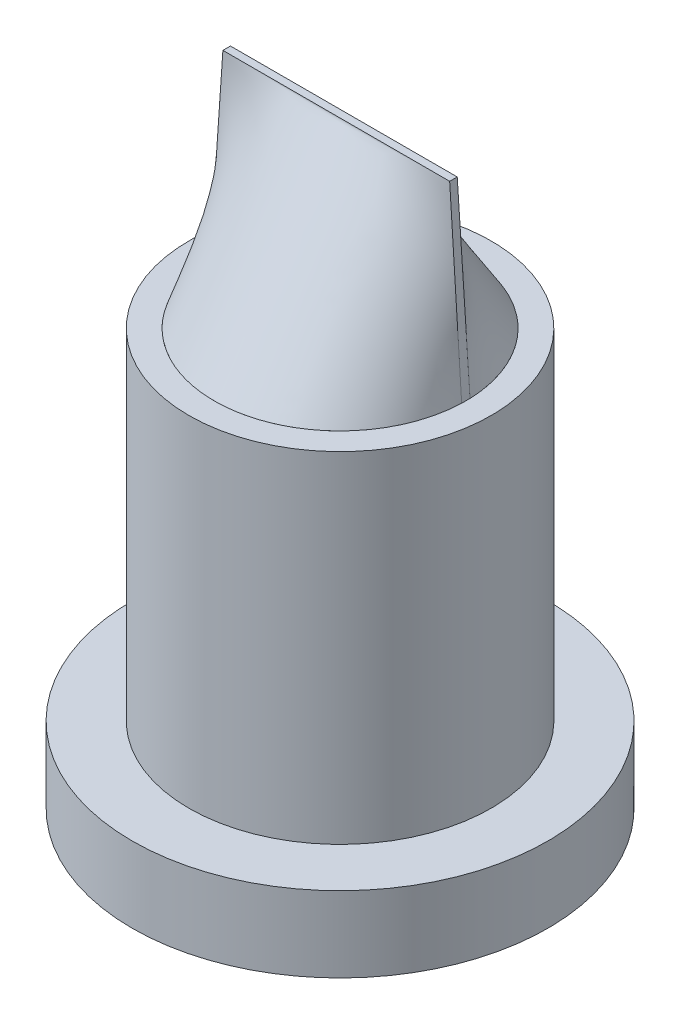
ISO-10303-21;
HEADER;
FILE_DESCRIPTION(('STEP AP214'),'2;1');
FILE_NAME('part.step','',(''),(''),'','','');
FILE_SCHEMA(('AUTOMOTIVE_DESIGN { 1 0 10303 214 1 1 1 1 }'));
ENDSEC;
DATA;
#1=APPLICATION_CONTEXT('core data for automotive mechanical design processes');
#2=APPLICATION_PROTOCOL_DEFINITION('international standard','automotive_design',2000,#1);
#3=PRODUCT_CONTEXT('',#1,'mechanical');
#4=PRODUCT('Part','Part','',(#3));
#5=PRODUCT_RELATED_PRODUCT_CATEGORY('part','',(#4));
#6=PRODUCT_DEFINITION_FORMATION('','',#4);
#7=PRODUCT_DEFINITION_CONTEXT('part definition',#1,'design');
#8=PRODUCT_DEFINITION('design','',#6,#7);
#9=PRODUCT_DEFINITION_SHAPE('','',#8);
#10=(LENGTH_UNIT() NAMED_UNIT(*) SI_UNIT(.MILLI.,.METRE.));
#11=(NAMED_UNIT(*) PLANE_ANGLE_UNIT() SI_UNIT($,.RADIAN.));
#12=(NAMED_UNIT(*) SI_UNIT($,.STERADIAN.) SOLID_ANGLE_UNIT());
#13=UNCERTAINTY_MEASURE_WITH_UNIT(LENGTH_MEASURE(1.E-05),#10,'distance_accuracy_value','');
#14=(GEOMETRIC_REPRESENTATION_CONTEXT(3) GLOBAL_UNCERTAINTY_ASSIGNED_CONTEXT((#13)) GLOBAL_UNIT_ASSIGNED_CONTEXT((#10,
#11,#12)) REPRESENTATION_CONTEXT('',''));
#15=CARTESIAN_POINT('',(0.,0.,0.));
#16=DIRECTION('',(0.,0.,1.));
#17=DIRECTION('',(1.,0.,0.));
#18=AXIS2_PLACEMENT_3D('',#15,#16,#17);
#19=CARTESIAN_POINT('',(0.,5.5,3.33));
#20=DIRECTION('',(0.,1.,0.));
#21=DIRECTION('',(-1.,0.,0.));
#22=AXIS2_PLACEMENT_3D('',#19,#20,#21);
#23=PLANE('',#22);
#24=CARTESIAN_POINT('',(3.32815154024058,5.5,0.110938384674685));
#25=CARTESIAN_POINT('',(3.31891180661128,5.5,0.388130393553708));
#26=CARTESIAN_POINT('',(3.27467847076508,5.5,0.699349139425638));
#27=CARTESIAN_POINT('',(3.05631600477307,5.5,1.36804268379158));
#28=CARTESIAN_POINT('',(2.88047196357901,5.5,1.726573501282));
#29=CARTESIAN_POINT('',(2.47527903565156,5.5,2.23812698315743));
#30=CARTESIAN_POINT('',(2.31683430362535,5.5,2.40363102799837));
#31=CARTESIAN_POINT('',(1.95274555680312,5.5,2.70775702373705));
#32=CARTESIAN_POINT('',(1.74702705293222,5.5,2.84624278845254));
#33=CARTESIAN_POINT('',(1.29590261554551,5.5,3.07796002987652));
#34=CARTESIAN_POINT('',(1.05052671088352,5.5,3.17100513872955));
#35=CARTESIAN_POINT('',(0.536696828710943,5.5,3.29709515697994));
#36=CARTESIAN_POINT('',(0.268404123866367,5.5,3.33));
#37=CARTESIAN_POINT('',(-0.268404123866367,5.5,3.33));
#38=CARTESIAN_POINT('',(-0.536696828710944,5.5,3.29709515697994));
#39=CARTESIAN_POINT('',(-1.05052671088352,5.5,3.17100513872955));
#40=CARTESIAN_POINT('',(-1.29590261554551,5.5,3.07796002987652));
#41=CARTESIAN_POINT('',(-1.74702705293222,5.5,2.84624278845254));
#42=CARTESIAN_POINT('',(-1.95274555680312,5.5,2.70775702373705));
#43=CARTESIAN_POINT('',(-2.31683430362535,5.5,2.40363102799837));
#44=CARTESIAN_POINT('',(-2.47527903565156,5.5,2.23812698315743));
#45=CARTESIAN_POINT('',(-2.88047196357901,5.5,1.726573501282));
#46=CARTESIAN_POINT('',(-3.05631600477307,5.5,1.36804268379158));
#47=CARTESIAN_POINT('',(-3.27467847076508,5.5,0.699349139425638));
#48=CARTESIAN_POINT('',(-3.31891180661128,5.5,0.388130393553707));
#49=CARTESIAN_POINT('',(-3.32815154024058,5.5,0.110938384674684));
#50=B_SPLINE_CURVE_WITH_KNOTS('',3,(#24,#25,#26,#27,#28,#29,#30,#31,#32,#33,#34,#35,#36,#37,#38,
#39,#40,#41,#42,#43,#44,#45,#46,#47,#48,#49),.UNSPECIFIED.,.F.,.F.,(4,2,2,2,2,2,2,2,2,2,2,2,4),
(0.,0.125,0.25,0.3125,0.375,0.4375,0.5,0.5625,0.625,0.6875,0.75,0.875,1.),.UNSPECIFIED.);
#51=CARTESIAN_POINT('',(3.32815154024058,5.5,0.110938384674685));
#52=VERTEX_POINT('',#51);
#53=CARTESIAN_POINT('',(-3.32815154024058,5.5,0.110938384674684));
#54=VERTEX_POINT('',#53);
#55=EDGE_CURVE('E49',#52,#54,#50,.T.);
#56=ORIENTED_EDGE('',*,*,#55,.T.);
#57=CARTESIAN_POINT('',(-3.32815154024058,5.5,0.110938384674684));
#58=CARTESIAN_POINT('',(-3.32938350472449,5.5,0.073979450157481));
#59=CARTESIAN_POINT('',(-3.32999948696644,5.5,0.0369897250787395));
#60=CARTESIAN_POINT('',(-3.32999948696644,5.5,-0.0369897250787436));
#61=CARTESIAN_POINT('',(-3.32938350472449,5.5,-0.0739794501574851));
#62=CARTESIAN_POINT('',(-3.32815154024058,5.5,-0.110938384674688));
#63=B_SPLINE_CURVE_WITH_KNOTS('',3,(#57,#58,#59,#60,#61,#62),.UNSPECIFIED.,.F.,.F.,(4,2,4),(0.,
0.5,1.),.UNSPECIFIED.);
#64=CARTESIAN_POINT('',(-3.32815154024058,5.5,-0.110938384674688));
#65=VERTEX_POINT('',#64);
#66=EDGE_CURVE('E81',#54,#65,#63,.T.);
#67=ORIENTED_EDGE('',*,*,#66,.T.);
#68=CARTESIAN_POINT('',(-3.32815154024058,5.5,-0.110938384674688));
#69=CARTESIAN_POINT('',(-3.31891180661128,5.5,-0.388130393553712));
#70=CARTESIAN_POINT('',(-3.27467847076508,5.5,-0.699349139425642));
#71=CARTESIAN_POINT('',(-3.05631600477307,5.5,-1.36804268379158));
#72=CARTESIAN_POINT('',(-2.88047196357901,5.5,-1.726573501282));
#73=CARTESIAN_POINT('',(-2.47527903565156,5.5,-2.23812698315743));
#74=CARTESIAN_POINT('',(-2.31683430362535,5.5,-2.40363102799837));
#75=CARTESIAN_POINT('',(-1.95274555680312,5.5,-2.70775702373705));
#76=CARTESIAN_POINT('',(-1.74702705293222,5.5,-2.84624278845255));
#77=CARTESIAN_POINT('',(-1.29590261554551,5.5,-3.07796002987652));
#78=CARTESIAN_POINT('',(-1.05052671088352,5.5,-3.17100513872955));
#79=CARTESIAN_POINT('',(-0.536696828710943,5.5,-3.29709515697994));
#80=CARTESIAN_POINT('',(-0.268404123866367,5.5,-3.33));
#81=CARTESIAN_POINT('',(0.268404123866368,5.5,-3.33));
#82=CARTESIAN_POINT('',(0.536696828710945,5.5,-3.29709515697994));
#83=CARTESIAN_POINT('',(1.05052671088352,5.5,-3.17100513872955));
#84=CARTESIAN_POINT('',(1.29590261554551,5.5,-3.07796002987652));
#85=CARTESIAN_POINT('',(1.74702705293222,5.5,-2.84624278845255));
#86=CARTESIAN_POINT('',(1.95274555680312,5.5,-2.70775702373705));
#87=CARTESIAN_POINT('',(2.31683430362535,5.5,-2.40363102799837));
#88=CARTESIAN_POINT('',(2.47527903565156,5.5,-2.23812698315743));
#89=CARTESIAN_POINT('',(2.88047196357901,5.5,-1.726573501282));
#90=CARTESIAN_POINT('',(3.05631600477307,5.5,-1.36804268379158));
#91=CARTESIAN_POINT('',(3.27467847076508,5.5,-0.69934913942564));
#92=CARTESIAN_POINT('',(3.31891180661128,5.5,-0.38813039355371));
#93=CARTESIAN_POINT('',(3.32815154024058,5.5,-0.110938384674689));
#94=B_SPLINE_CURVE_WITH_KNOTS('',3,(#68,#69,#70,#71,#72,#73,#74,#75,#76,#77,#78,#79,#80,#81,#82,
#83,#84,#85,#86,#87,#88,#89,#90,#91,#92,#93),.UNSPECIFIED.,.F.,.F.,(4,2,2,2,2,2,2,2,2,2,2,2,4),
(0.,0.125,0.25,0.3125,0.375,0.4375,0.5,0.5625,0.625,0.6875,0.75,0.875,1.),.UNSPECIFIED.);
#95=CARTESIAN_POINT('',(3.32815154024058,5.5,-0.110938384674689));
#96=VERTEX_POINT('',#95);
#97=EDGE_CURVE('E84',#65,#96,#94,.T.);
#98=ORIENTED_EDGE('',*,*,#97,.T.);
#99=CARTESIAN_POINT('',(3.32815154024058,5.5,-0.110938384674687));
#100=CARTESIAN_POINT('',(3.32938350472449,5.5,-0.0739794501574843));
#101=CARTESIAN_POINT('',(3.32999948696644,5.5,-0.0369897250787428));
#102=CARTESIAN_POINT('',(3.32999948696644,5.5,0.0369897250787403));
#103=CARTESIAN_POINT('',(3.32938350472449,5.5,0.0739794501574818));
#104=CARTESIAN_POINT('',(3.32815154024058,5.5,0.110938384674685));
#105=B_SPLINE_CURVE_WITH_KNOTS('',3,(#99,#100,#101,#102,#103,#104),.UNSPECIFIED.,.F.,.F.,(4,2,
4),(0.,0.5,1.),.UNSPECIFIED.);
#106=EDGE_CURVE('E64',#96,#52,#105,.T.);
#107=ORIENTED_EDGE('',*,*,#106,.T.);
#108=EDGE_LOOP('',(#56,#67,#98,#107));
#109=FACE_BOUND('',#108,.T.);
#110=ADVANCED_FACE('F41',(#109),#23,.F.);
#111=CARTESIAN_POINT('',(0.,10.4161519021316,-5.42074297019046E-13));
#112=DIRECTION('',(0.,-1.,0.));
#113=DIRECTION('',(0.,0.,-1.));
#114=AXIS2_PLACEMENT_3D('',#111,#112,#113);
#115=PLANE('',#114);
#116=DIRECTION('',(1.,0.,0.));
#117=VECTOR('',#116,1.);
#118=CARTESIAN_POINT('',(0.,10.4161519021316,0.1));
#119=LINE('',#118,#117);
#120=CARTESIAN_POINT('',(-3.,10.4161519021316,0.1));
#121=VERTEX_POINT('',#120);
#122=CARTESIAN_POINT('',(3.,10.4161519021316,0.1));
#123=VERTEX_POINT('',#122);
#124=EDGE_CURVE('E12',#121,#123,#119,.T.);
#125=ORIENTED_EDGE('',*,*,#124,.T.);
#126=DIRECTION('',(0.,0.,-1.));
#127=VECTOR('',#126,1.);
#128=CARTESIAN_POINT('',(3.,10.4161519021316,0.));
#129=LINE('',#128,#127);
#130=CARTESIAN_POINT('',(3.,10.4161519021316,-0.1));
#131=VERTEX_POINT('',#130);
#132=EDGE_CURVE('E119',#123,#131,#129,.T.);
#133=ORIENTED_EDGE('',*,*,#132,.T.);
#134=DIRECTION('',(-1.,0.,0.));
#135=VECTOR('',#134,1.);
#136=CARTESIAN_POINT('',(0.,10.4161519021316,-0.1));
#137=LINE('',#136,#135);
#138=CARTESIAN_POINT('',(-3.,10.4161519021316,-0.1));
#139=VERTEX_POINT('',#138);
#140=EDGE_CURVE('E102',#131,#139,#137,.T.);
#141=ORIENTED_EDGE('',*,*,#140,.T.);
#142=DIRECTION('',(0.,0.,1.));
#143=VECTOR('',#142,1.);
#144=CARTESIAN_POINT('',(-3.,10.4161519021316,0.));
#145=LINE('',#144,#143);
#146=EDGE_CURVE('E89',#139,#121,#145,.T.);
#147=ORIENTED_EDGE('',*,*,#146,.T.);
#148=EDGE_LOOP('',(#125,#133,#141,#147));
#149=FACE_BOUND('',#148,.T.);
#150=ADVANCED_FACE('F43',(#149),#115,.F.);
#151=CARTESIAN_POINT('',(3.32815154024058,5.5,0.110938384674685));
#152=CARTESIAN_POINT('',(3.,10.4161519021316,0.1));
#153=CARTESIAN_POINT('',(3.31891180661128,5.5,0.388130393553708));
#154=CARTESIAN_POINT('',(2.75,10.4161519021316,0.1));
#155=CARTESIAN_POINT('',(3.27467847076508,5.5,0.699349139425638));
#156=CARTESIAN_POINT('',(2.5,10.4161519021316,0.1));
#157=CARTESIAN_POINT('',(3.05631600477307,5.5,1.36804268379158));
#158=CARTESIAN_POINT('',(2.,10.4161519021316,0.1));
#159=CARTESIAN_POINT('',(2.88047196357901,5.5,1.726573501282));
#160=CARTESIAN_POINT('',(1.75,10.4161519021316,0.1));
#161=CARTESIAN_POINT('',(2.47527903565156,5.5,2.23812698315743));
#162=CARTESIAN_POINT('',(1.375,10.4161519021316,0.1));
#163=CARTESIAN_POINT('',(2.31683430362535,5.5,2.40363102799837));
#164=CARTESIAN_POINT('',(1.25,10.4161519021316,0.1));
#165=CARTESIAN_POINT('',(1.95274555680312,5.5,2.70775702373705));
#166=CARTESIAN_POINT('',(0.999999999999999,10.4161519021316,0.1));
#167=CARTESIAN_POINT('',(1.74702705293222,5.5,2.84624278845254));
#168=CARTESIAN_POINT('',(0.874999999999999,10.4161519021316,0.1));
#169=CARTESIAN_POINT('',(1.29590261554551,5.5,3.07796002987652));
#170=CARTESIAN_POINT('',(0.624999999999999,10.4161519021316,0.1));
#171=CARTESIAN_POINT('',(1.05052671088352,5.5,3.17100513872955));
#172=CARTESIAN_POINT('',(0.499999999999999,10.4161519021316,0.1));
#173=CARTESIAN_POINT('',(0.536696828710943,5.5,3.29709515697994));
#174=CARTESIAN_POINT('',(0.249999999999998,10.4161519021316,0.1));
#175=CARTESIAN_POINT('',(0.268404123866367,5.5,3.33));
#176=CARTESIAN_POINT('',(0.124999999999998,10.4161519021316,0.1));
#177=CARTESIAN_POINT('',(-0.268404123866367,5.5,3.33));
#178=CARTESIAN_POINT('',(-0.125000000000002,10.4161519021316,0.1));
#179=CARTESIAN_POINT('',(-0.536696828710944,5.5,3.29709515697994));
#180=CARTESIAN_POINT('',(-0.250000000000002,10.4161519021316,0.1));
#181=CARTESIAN_POINT('',(-1.05052671088352,5.5,3.17100513872955));
#182=CARTESIAN_POINT('',(-0.500000000000003,10.4161519021316,0.1));
#183=CARTESIAN_POINT('',(-1.29590261554551,5.5,3.07796002987652));
#184=CARTESIAN_POINT('',(-0.625000000000003,10.4161519021316,0.1));
#185=CARTESIAN_POINT('',(-1.74702705293222,5.5,2.84624278845254));
#186=CARTESIAN_POINT('',(-0.875000000000003,10.4161519021316,0.1));
#187=CARTESIAN_POINT('',(-1.95274555680312,5.5,2.70775702373705));
#188=CARTESIAN_POINT('',(-1.,10.4161519021316,0.1));
#189=CARTESIAN_POINT('',(-2.31683430362535,5.5,2.40363102799837));
#190=CARTESIAN_POINT('',(-1.25,10.4161519021316,0.1));
#191=CARTESIAN_POINT('',(-2.47527903565156,5.5,2.23812698315743));
#192=CARTESIAN_POINT('',(-1.375,10.4161519021316,0.1));
#193=CARTESIAN_POINT('',(-2.88047196357901,5.5,1.726573501282));
#194=CARTESIAN_POINT('',(-1.75,10.4161519021316,0.1));
#195=CARTESIAN_POINT('',(-3.05631600477307,5.5,1.36804268379158));
#196=CARTESIAN_POINT('',(-2.,10.4161519021316,0.1));
#197=CARTESIAN_POINT('',(-3.27467847076508,5.5,0.699349139425638));
#198=CARTESIAN_POINT('',(-2.5,10.4161519021316,0.1));
#199=CARTESIAN_POINT('',(-3.31891180661128,5.5,0.388130393553707));
#200=CARTESIAN_POINT('',(-2.75,10.4161519021316,0.1));
#201=CARTESIAN_POINT('',(-3.32815154024058,5.5,0.110938384674684));
#202=CARTESIAN_POINT('',(-3.,10.4161519021316,0.1));
#203=B_SPLINE_SURFACE_WITH_KNOTS('',3,1,((#151,#152),(#153,#154),(#155,#156),(#157,#158),(#159,
#160),(#161,#162),(#163,#164),(#165,#166),(#167,#168),(#169,#170),(#171,#172),(#173,#174),(#175,
#176),(#177,#178),(#179,#180),(#181,#182),(#183,#184),(#185,#186),(#187,#188),(#189,#190),(#191,
#192),(#193,#194),(#195,#196),(#197,#198),(#199,#200),(#201,#202)),.UNSPECIFIED.,.F.,.F.,.F.,(4,
2,2,2,2,2,2,2,2,2,2,2,4),(2,2),(0.,0.125,0.25,0.3125,0.375,0.4375,0.5,0.5625,0.625,0.6875,0.75,
0.875,1.),(0.,1.),.UNSPECIFIED.);
#204=DIRECTION('',(-0.0666013034205495,0.99777719847157,-0.0022200434473514));
#205=VECTOR('',#204,1.);
#206=CARTESIAN_POINT('',(3.16407577012029,7.95807595106581,0.105469192337342));
#207=LINE('',#206,#205);
#208=EDGE_CURVE('E56',#52,#123,#207,.T.);
#209=DIRECTION('',(-0.0666013034205495,-0.99777719847157,0.00222004344735124));
#210=VECTOR('',#209,1.);
#211=CARTESIAN_POINT('',(-3.16407577012029,7.95807595106581,0.105469192337342));
#212=LINE('',#211,#210);
#213=EDGE_CURVE('E97',#121,#54,#212,.T.);
#214=ORIENTED_EDGE('',*,*,#55,.F.);
#215=ORIENTED_EDGE('',*,*,#208,.T.);
#216=ORIENTED_EDGE('',*,*,#124,.F.);
#217=ORIENTED_EDGE('',*,*,#213,.T.);
#218=EDGE_LOOP('',(#214,#215,#216,#217));
#219=FACE_BOUND('',#218,.T.);
#220=ADVANCED_FACE('F129',(#219),#203,.F.);
#221=CARTESIAN_POINT('',(3.32815154024058,5.5,-0.110938384674687));
#222=CARTESIAN_POINT('',(3.,10.4161519021316,-0.1));
#223=CARTESIAN_POINT('',(3.32938350472449,5.5,-0.0739794501574843));
#224=CARTESIAN_POINT('',(3.,10.4161519021316,-0.0666666666666667));
#225=CARTESIAN_POINT('',(3.32999948696644,5.5,-0.0369897250787428));
#226=CARTESIAN_POINT('',(3.,10.4161519021316,-0.0333333333333334));
#227=CARTESIAN_POINT('',(3.32999948696644,5.5,0.0369897250787403));
#228=CARTESIAN_POINT('',(3.,10.4161519021316,0.0333333333333333));
#229=CARTESIAN_POINT('',(3.32938350472449,5.5,0.0739794501574818));
#230=CARTESIAN_POINT('',(3.,10.4161519021316,0.0666666666666666));
#231=CARTESIAN_POINT('',(3.32815154024058,5.5,0.110938384674685));
#232=CARTESIAN_POINT('',(3.,10.4161519021316,0.1));
#233=B_SPLINE_SURFACE_WITH_KNOTS('',3,1,((#221,#222),(#223,#224),(#225,#226),(#227,#228),(#229,
#230),(#231,#232)),.UNSPECIFIED.,.F.,.F.,.F.,(4,2,4),(2,2),(0.,0.5,1.),(0.,1.),.UNSPECIFIED.);
#234=DIRECTION('',(-0.0666013034205495,0.99777719847157,0.00222004344735222));
#235=VECTOR('',#234,1.);
#236=CARTESIAN_POINT('',(3.16407577012029,7.95807595106581,-0.105469192337344));
#237=LINE('',#236,#235);
#238=EDGE_CURVE('E100',#96,#131,#237,.T.);
#239=ORIENTED_EDGE('',*,*,#106,.F.);
#240=ORIENTED_EDGE('',*,*,#238,.T.);
#241=ORIENTED_EDGE('',*,*,#132,.F.);
#242=ORIENTED_EDGE('',*,*,#208,.F.);
#243=EDGE_LOOP('',(#239,#240,#241,#242));
#244=FACE_BOUND('',#243,.T.);
#245=ADVANCED_FACE('F128',(#244),#233,.F.);
#246=CARTESIAN_POINT('',(-3.32815154024058,5.5,-0.110938384674688));
#247=CARTESIAN_POINT('',(-3.,10.4161519021316,-0.1));
#248=CARTESIAN_POINT('',(-3.31891180661128,5.5,-0.388130393553712));
#249=CARTESIAN_POINT('',(-2.75,10.4161519021316,-0.1));
#250=CARTESIAN_POINT('',(-3.27467847076508,5.5,-0.699349139425642));
#251=CARTESIAN_POINT('',(-2.5,10.4161519021316,-0.1));
#252=CARTESIAN_POINT('',(-3.05631600477307,5.5,-1.36804268379158));
#253=CARTESIAN_POINT('',(-2.,10.4161519021316,-0.1));
#254=CARTESIAN_POINT('',(-2.88047196357901,5.5,-1.726573501282));
#255=CARTESIAN_POINT('',(-1.75,10.4161519021316,-0.1));
#256=CARTESIAN_POINT('',(-2.47527903565156,5.5,-2.23812698315743));
#257=CARTESIAN_POINT('',(-1.375,10.4161519021316,-0.1));
#258=CARTESIAN_POINT('',(-2.31683430362535,5.5,-2.40363102799837));
#259=CARTESIAN_POINT('',(-1.25,10.4161519021316,-0.1));
#260=CARTESIAN_POINT('',(-1.95274555680312,5.5,-2.70775702373705));
#261=CARTESIAN_POINT('',(-0.999999999999998,10.4161519021316,-0.1));
#262=CARTESIAN_POINT('',(-1.74702705293222,5.5,-2.84624278845255));
#263=CARTESIAN_POINT('',(-0.874999999999998,10.4161519021316,-0.1));
#264=CARTESIAN_POINT('',(-1.29590261554551,5.5,-3.07796002987652));
#265=CARTESIAN_POINT('',(-0.624999999999998,10.4161519021316,-0.1));
#266=CARTESIAN_POINT('',(-1.05052671088352,5.5,-3.17100513872955));
#267=CARTESIAN_POINT('',(-0.499999999999997,10.4161519021316,-0.1));
#268=CARTESIAN_POINT('',(-0.536696828710943,5.5,-3.29709515697994));
#269=CARTESIAN_POINT('',(-0.249999999999998,10.4161519021316,-0.1));
#270=CARTESIAN_POINT('',(-0.268404123866367,5.5,-3.33));
#271=CARTESIAN_POINT('',(-0.124999999999998,10.4161519021316,-0.1));
#272=CARTESIAN_POINT('',(0.268404123866368,5.5,-3.33));
#273=CARTESIAN_POINT('',(0.125000000000002,10.4161519021316,-0.1));
#274=CARTESIAN_POINT('',(0.536696828710945,5.5,-3.29709515697994));
#275=CARTESIAN_POINT('',(0.250000000000002,10.4161519021316,-0.1));
#276=CARTESIAN_POINT('',(1.05052671088352,5.5,-3.17100513872955));
#277=CARTESIAN_POINT('',(0.500000000000003,10.4161519021316,-0.1));
#278=CARTESIAN_POINT('',(1.29590261554551,5.5,-3.07796002987652));
#279=CARTESIAN_POINT('',(0.625000000000003,10.4161519021316,-0.1));
#280=CARTESIAN_POINT('',(1.74702705293222,5.5,-2.84624278845255));
#281=CARTESIAN_POINT('',(0.875000000000003,10.4161519021316,-0.1));
#282=CARTESIAN_POINT('',(1.95274555680312,5.5,-2.70775702373705));
#283=CARTESIAN_POINT('',(1.,10.4161519021316,-0.1));
#284=CARTESIAN_POINT('',(2.31683430362535,5.5,-2.40363102799837));
#285=CARTESIAN_POINT('',(1.25,10.4161519021316,-0.1));
#286=CARTESIAN_POINT('',(2.47527903565156,5.5,-2.23812698315743));
#287=CARTESIAN_POINT('',(1.375,10.4161519021316,-0.1));
#288=CARTESIAN_POINT('',(2.88047196357901,5.5,-1.726573501282));
#289=CARTESIAN_POINT('',(1.75,10.4161519021316,-0.1));
#290=CARTESIAN_POINT('',(3.05631600477307,5.5,-1.36804268379158));
#291=CARTESIAN_POINT('',(2.,10.4161519021316,-0.1));
#292=CARTESIAN_POINT('',(3.27467847076508,5.5,-0.69934913942564));
#293=CARTESIAN_POINT('',(2.5,10.4161519021316,-0.1));
#294=CARTESIAN_POINT('',(3.31891180661128,5.5,-0.38813039355371));
#295=CARTESIAN_POINT('',(2.75,10.4161519021316,-0.1));
#296=CARTESIAN_POINT('',(3.32815154024058,5.5,-0.110938384674689));
#297=CARTESIAN_POINT('',(3.,10.4161519021316,-0.1));
#298=B_SPLINE_SURFACE_WITH_KNOTS('',3,1,((#246,#247),(#248,#249),(#250,#251),(#252,#253),(#254,
#255),(#256,#257),(#258,#259),(#260,#261),(#262,#263),(#264,#265),(#266,#267),(#268,#269),(#270,
#271),(#272,#273),(#274,#275),(#276,#277),(#278,#279),(#280,#281),(#282,#283),(#284,#285),(#286,
#287),(#288,#289),(#290,#291),(#292,#293),(#294,#295),(#296,#297)),.UNSPECIFIED.,.F.,.F.,.F.,(4,
2,2,2,2,2,2,2,2,2,2,2,4),(2,2),(0.,0.125,0.25,0.3125,0.375,0.4375,0.5,0.5625,0.625,0.6875,0.75,
0.875,1.),(0.,1.),.UNSPECIFIED.);
#299=DIRECTION('',(0.0666013034205495,0.99777719847157,0.00222004344735208));
#300=VECTOR('',#299,1.);
#301=CARTESIAN_POINT('',(-3.16407577012029,7.95807595106581,-0.105469192337344));
#302=LINE('',#301,#300);
#303=EDGE_CURVE('E92',#65,#139,#302,.T.);
#304=ORIENTED_EDGE('',*,*,#97,.F.);
#305=ORIENTED_EDGE('',*,*,#303,.T.);
#306=ORIENTED_EDGE('',*,*,#140,.F.);
#307=ORIENTED_EDGE('',*,*,#238,.F.);
#308=EDGE_LOOP('',(#304,#305,#306,#307));
#309=FACE_BOUND('',#308,.T.);
#310=ADVANCED_FACE('F99',(#309),#298,.F.);
#311=CARTESIAN_POINT('',(-3.32815154024058,5.5,0.110938384674684));
#312=CARTESIAN_POINT('',(-3.,10.4161519021316,0.1));
#313=CARTESIAN_POINT('',(-3.32938350472449,5.5,0.073979450157481));
#314=CARTESIAN_POINT('',(-3.,10.4161519021316,0.0666666666666667));
#315=CARTESIAN_POINT('',(-3.32999948696644,5.5,0.0369897250787395));
#316=CARTESIAN_POINT('',(-3.,10.4161519021316,0.0333333333333334));
#317=CARTESIAN_POINT('',(-3.32999948696644,5.5,-0.0369897250787436));
#318=CARTESIAN_POINT('',(-3.,10.4161519021316,-0.0333333333333333));
#319=CARTESIAN_POINT('',(-3.32938350472449,5.5,-0.0739794501574851));
#320=CARTESIAN_POINT('',(-3.,10.4161519021316,-0.0666666666666666));
#321=CARTESIAN_POINT('',(-3.32815154024058,5.5,-0.110938384674688));
#322=CARTESIAN_POINT('',(-3.,10.4161519021316,-0.1));
#323=B_SPLINE_SURFACE_WITH_KNOTS('',3,1,((#311,#312),(#313,#314),(#315,#316),(#317,#318),(#319,
#320),(#321,#322)),.UNSPECIFIED.,.F.,.F.,.F.,(4,2,4),(2,2),(0.,0.5,1.),(0.,1.),.UNSPECIFIED.);
#324=ORIENTED_EDGE('',*,*,#66,.F.);
#325=ORIENTED_EDGE('',*,*,#213,.F.);
#326=ORIENTED_EDGE('',*,*,#146,.F.);
#327=ORIENTED_EDGE('',*,*,#303,.F.);
#328=EDGE_LOOP('',(#324,#325,#326,#327));
#329=FACE_BOUND('',#328,.T.);
#330=ADVANCED_FACE('F93',(#329),#323,.F.);
#331=CLOSED_SHELL('',(#110,#150,#220,#245,#310,#330));
#332=MANIFOLD_SOLID_BREP('B2',#331);
#333=CARTESIAN_POINT('',(0.,5.5,3.33));
#334=DIRECTION('',(0.,1.,0.));
#335=DIRECTION('',(0.,0.,1.));
#336=AXIS2_PLACEMENT_3D('',#333,#334,#335);
#337=PLANE('',#336);
#338=CARTESIAN_POINT('',(0.,5.5,0.));
#339=DIRECTION('',(0.,1.,0.));
#340=DIRECTION('',(0.,0.,1.));
#341=AXIS2_PLACEMENT_3D('',#338,#339,#340);
#342=CIRCLE('',#341,4.);
#343=CARTESIAN_POINT('',(0.,5.5,4.));
#344=VERTEX_POINT('',#343);
#345=EDGE_CURVE('E40',#344,#344,#342,.T.);
#346=ORIENTED_EDGE('',*,*,#345,.T.);
#347=EDGE_LOOP('',(#346));
#348=FACE_BOUND('',#347,.T.);
#349=CARTESIAN_POINT('',(0.,5.5,0.));
#350=DIRECTION('',(0.,1.,0.));
#351=DIRECTION('',(0.,0.,1.));
#352=AXIS2_PLACEMENT_3D('',#349,#350,#351);
#353=CIRCLE('',#352,3.33);
#354=CARTESIAN_POINT('',(0.,5.5,3.33));
#355=VERTEX_POINT('',#354);
#356=EDGE_CURVE('E235',#355,#355,#353,.T.);
#357=ORIENTED_EDGE('',*,*,#356,.F.);
#358=EDGE_LOOP('',(#357));
#359=FACE_BOUND('',#358,.T.);
#360=ADVANCED_FACE('F213',(#348,#359),#337,.T.);
#361=CARTESIAN_POINT('',(0.,12.686003096819,0.));
#362=DIRECTION('',(0.,1.,0.));
#363=DIRECTION('',(0.,0.,1.));
#364=AXIS2_PLACEMENT_3D('',#361,#362,#363);
#365=CYLINDRICAL_SURFACE('',#364,4.);
#366=CARTESIAN_POINT('',(0.,-3.5,0.));
#367=DIRECTION('',(0.,1.,0.));
#368=DIRECTION('',(0.,0.,1.));
#369=AXIS2_PLACEMENT_3D('',#366,#367,#368);
#370=CIRCLE('',#369,4.);
#371=CARTESIAN_POINT('',(0.,-3.5,4.));
#372=VERTEX_POINT('',#371);
#373=EDGE_CURVE('E219',#372,#372,#370,.T.);
#374=ORIENTED_EDGE('',*,*,#373,.T.);
#375=EDGE_LOOP('',(#374));
#376=FACE_BOUND('',#375,.T.);
#377=ORIENTED_EDGE('',*,*,#345,.F.);
#378=EDGE_LOOP('',(#377));
#379=FACE_BOUND('',#378,.T.);
#380=ADVANCED_FACE('F243',(#376,#379),#365,.T.);
#381=CARTESIAN_POINT('',(0.,-3.5,4.));
#382=DIRECTION('',(0.,1.,0.));
#383=DIRECTION('',(0.,0.,1.));
#384=AXIS2_PLACEMENT_3D('',#381,#382,#383);
#385=PLANE('',#384);
#386=CARTESIAN_POINT('',(0.,-3.5,0.));
#387=DIRECTION('',(0.,1.,0.));
#388=DIRECTION('',(0.,0.,1.));
#389=AXIS2_PLACEMENT_3D('',#386,#387,#388);
#390=CIRCLE('',#389,5.5);
#391=CARTESIAN_POINT('',(0.,-3.5,5.49999999999999));
#392=VERTEX_POINT('',#391);
#393=EDGE_CURVE('E223',#392,#392,#390,.T.);
#394=ORIENTED_EDGE('',*,*,#393,.T.);
#395=EDGE_LOOP('',(#394));
#396=FACE_BOUND('',#395,.T.);
#397=ORIENTED_EDGE('',*,*,#373,.F.);
#398=EDGE_LOOP('',(#397));
#399=FACE_BOUND('',#398,.T.);
#400=ADVANCED_FACE('F247',(#396,#399),#385,.T.);
#401=CARTESIAN_POINT('',(0.,12.686003096819,0.));
#402=DIRECTION('',(0.,1.,0.));
#403=DIRECTION('',(0.,0.,1.));
#404=AXIS2_PLACEMENT_3D('',#401,#402,#403);
#405=CYLINDRICAL_SURFACE('',#404,5.5);
#406=CARTESIAN_POINT('',(0.,-5.5,0.));
#407=DIRECTION('',(0.,1.,0.));
#408=DIRECTION('',(0.,0.,1.));
#409=AXIS2_PLACEMENT_3D('',#406,#407,#408);
#410=CIRCLE('',#409,5.5);
#411=CARTESIAN_POINT('',(0.,-5.5,5.5));
#412=VERTEX_POINT('',#411);
#413=EDGE_CURVE('E227',#412,#412,#410,.T.);
#414=ORIENTED_EDGE('',*,*,#413,.T.);
#415=EDGE_LOOP('',(#414));
#416=FACE_BOUND('',#415,.T.);
#417=ORIENTED_EDGE('',*,*,#393,.F.);
#418=EDGE_LOOP('',(#417));
#419=FACE_BOUND('',#418,.T.);
#420=ADVANCED_FACE('F251',(#416,#419),#405,.T.);
#421=CARTESIAN_POINT('',(0.,-5.5,5.5));
#422=DIRECTION('',(0.,-1.,0.));
#423=DIRECTION('',(0.,0.,-1.));
#424=AXIS2_PLACEMENT_3D('',#421,#422,#423);
#425=PLANE('',#424);
#426=CARTESIAN_POINT('',(0.,-5.5,0.));
#427=DIRECTION('',(0.,1.,0.));
#428=DIRECTION('',(0.,0.,1.));
#429=AXIS2_PLACEMENT_3D('',#426,#427,#428);
#430=CIRCLE('',#429,3.33);
#431=CARTESIAN_POINT('',(0.,-5.5,3.33));
#432=VERTEX_POINT('',#431);
#433=EDGE_CURVE('E232',#432,#432,#430,.T.);
#434=ORIENTED_EDGE('',*,*,#433,.T.);
#435=EDGE_LOOP('',(#434));
#436=FACE_BOUND('',#435,.T.);
#437=ORIENTED_EDGE('',*,*,#413,.F.);
#438=EDGE_LOOP('',(#437));
#439=FACE_BOUND('',#438,.T.);
#440=ADVANCED_FACE('F258',(#436,#439),#425,.T.);
#441=CARTESIAN_POINT('',(0.,12.686003096819,0.));
#442=DIRECTION('',(0.,1.,0.));
#443=DIRECTION('',(0.,0.,1.));
#444=AXIS2_PLACEMENT_3D('',#441,#442,#443);
#445=CYLINDRICAL_SURFACE('',#444,3.33);
#446=ORIENTED_EDGE('',*,*,#356,.T.);
#447=EDGE_LOOP('',(#446));
#448=FACE_BOUND('',#447,.T.);
#449=ORIENTED_EDGE('',*,*,#433,.F.);
#450=EDGE_LOOP('',(#449));
#451=FACE_BOUND('',#450,.T.);
#452=ADVANCED_FACE('F239',(#448,#451),#445,.F.);
#453=CLOSED_SHELL('',(#360,#380,#400,#420,#440,#452));
#454=MANIFOLD_SOLID_BREP('B6',#453);
#455=ADVANCED_BREP_SHAPE_REPRESENTATION('',(#18,#332,#454),#14);
#456=SHAPE_DEFINITION_REPRESENTATION(#9,#455);
ENDSEC;
END-ISO-10303-21;
